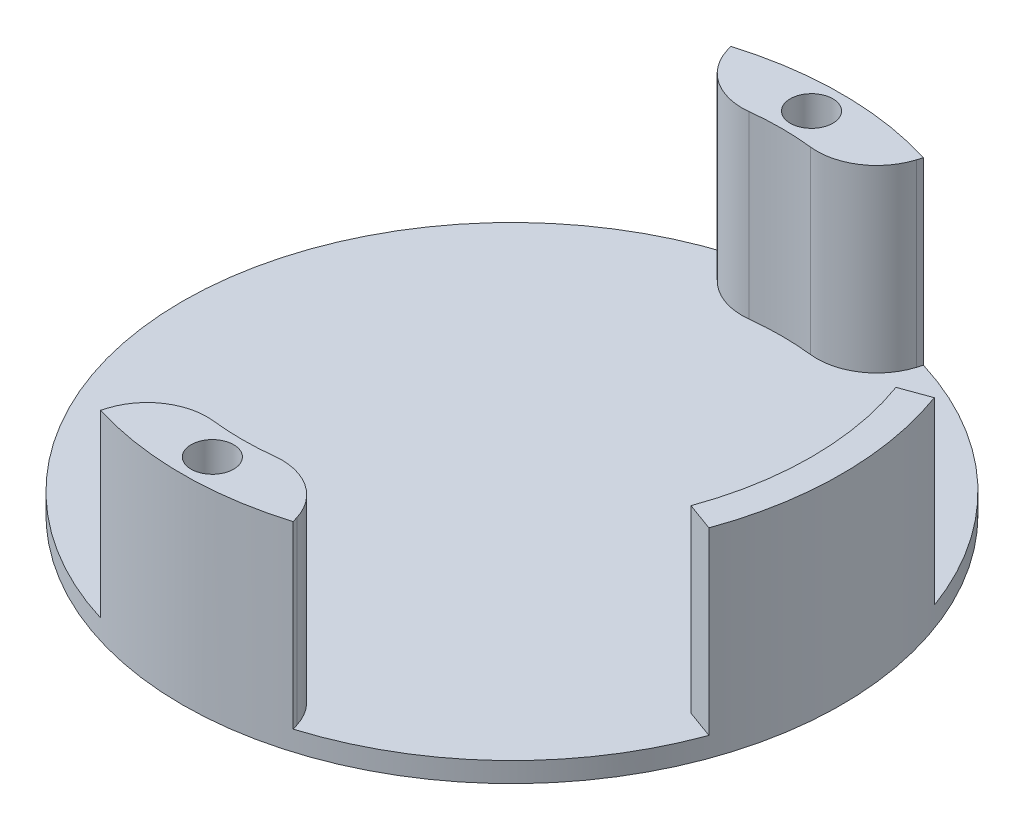
ISO-10303-21;
HEADER;
FILE_DESCRIPTION(('STEP AP214'),'2;1');
FILE_NAME('part.step','',(''),(''),'','','');
FILE_SCHEMA(('AUTOMOTIVE_DESIGN { 1 0 10303 214 1 1 1 1 }'));
ENDSEC;
DATA;
#1=APPLICATION_CONTEXT('core data for automotive mechanical design processes');
#2=APPLICATION_PROTOCOL_DEFINITION('international standard','automotive_design',2000,#1);
#3=PRODUCT_CONTEXT('',#1,'mechanical');
#4=PRODUCT('Part','Part','',(#3));
#5=PRODUCT_RELATED_PRODUCT_CATEGORY('part','',(#4));
#6=PRODUCT_DEFINITION_FORMATION('','',#4);
#7=PRODUCT_DEFINITION_CONTEXT('part definition',#1,'design');
#8=PRODUCT_DEFINITION('design','',#6,#7);
#9=PRODUCT_DEFINITION_SHAPE('','',#8);
#10=(LENGTH_UNIT() NAMED_UNIT(*) SI_UNIT(.MILLI.,.METRE.));
#11=(NAMED_UNIT(*) PLANE_ANGLE_UNIT() SI_UNIT($,.RADIAN.));
#12=(NAMED_UNIT(*) SI_UNIT($,.STERADIAN.) SOLID_ANGLE_UNIT());
#13=UNCERTAINTY_MEASURE_WITH_UNIT(LENGTH_MEASURE(1.E-05),#10,'distance_accuracy_value','');
#14=(GEOMETRIC_REPRESENTATION_CONTEXT(3) GLOBAL_UNCERTAINTY_ASSIGNED_CONTEXT((#13)) GLOBAL_UNIT_ASSIGNED_CONTEXT((#10,
#11,#12)) REPRESENTATION_CONTEXT('',''));
#15=CARTESIAN_POINT('',(0.,0.,0.));
#16=DIRECTION('',(0.,0.,1.));
#17=DIRECTION('',(1.,0.,0.));
#18=AXIS2_PLACEMENT_3D('',#15,#16,#17);
#19=CARTESIAN_POINT('',(7.93669994249363,42.3333333333333,-69.3976317609097));
#20=DIRECTION('',(0.,-1.,0.));
#21=DIRECTION('',(0.,0.,-1.));
#22=AXIS2_PLACEMENT_3D('',#19,#20,#21);
#23=CYLINDRICAL_SURFACE('',#22,12.7);
#24=DIRECTION('',(0.,-1.,0.));
#25=VECTOR('',#24,1.);
#26=CARTESIAN_POINT('',(6.49366358931297,42.3333333333333,-56.7798805316534));
#27=LINE('',#26,#25);
#28=CARTESIAN_POINT('',(6.49366358931298,4.23333333333333,-56.7798805316534));
#29=VERTEX_POINT('',#28);
#30=CARTESIAN_POINT('',(6.49366358931298,42.3333333333333,-56.7798805316534));
#31=VERTEX_POINT('',#30);
#32=EDGE_CURVE('E308',#29,#31,#27,.F.);
#33=ORIENTED_EDGE('',*,*,#32,.F.);
#34=CARTESIAN_POINT('',(7.93669994249363,4.23333333333333,-69.3976317609097));
#35=DIRECTION('',(0.,1.,0.));
#36=DIRECTION('',(0.,0.,1.));
#37=AXIS2_PLACEMENT_3D('',#34,#35,#36);
#38=CIRCLE('',#37,12.7);
#39=CARTESIAN_POINT('',(20.0817703432242,4.23333333333333,-65.6845111109309));
#40=VERTEX_POINT('',#39);
#41=EDGE_CURVE('E11',#29,#40,#38,.T.);
#42=ORIENTED_EDGE('',*,*,#41,.T.);
#43=DIRECTION('',(0.,-1.,0.));
#44=VECTOR('',#43,1.);
#45=CARTESIAN_POINT('',(20.0817703432242,42.3333333333333,-65.6845111109309));
#46=LINE('',#45,#44);
#47=CARTESIAN_POINT('',(20.0817703432242,42.3333333333333,-65.6845111109309));
#48=VERTEX_POINT('',#47);
#49=EDGE_CURVE('E321',#48,#40,#46,.T.);
#50=ORIENTED_EDGE('',*,*,#49,.F.);
#51=CARTESIAN_POINT('',(7.93669994249363,42.3333333333333,-69.3976317609097));
#52=DIRECTION('',(0.,1.,0.));
#53=DIRECTION('',(0.,0.,1.));
#54=AXIS2_PLACEMENT_3D('',#51,#52,#53);
#55=CIRCLE('',#54,12.7);
#56=EDGE_CURVE('E53',#31,#48,#55,.T.);
#57=ORIENTED_EDGE('',*,*,#56,.F.);
#58=EDGE_LOOP('',(#33,#42,#50,#57));
#59=FACE_BOUND('',#58,.T.);
#60=ADVANCED_FACE('F45',(#59),#23,.T.);
#61=CARTESIAN_POINT('',(0.,4.23333333333333,0.));
#62=DIRECTION('',(0.,1.,0.));
#63=DIRECTION('',(0.,0.,1.));
#64=AXIS2_PLACEMENT_3D('',#61,#62,#63);
#65=PLANE('',#64);
#66=ORIENTED_EDGE('',*,*,#41,.F.);
#67=CARTESIAN_POINT('',(0.,4.23333333333333,0.));
#68=DIRECTION('',(0.,1.,0.));
#69=DIRECTION('',(0.,0.,1.));
#70=AXIS2_PLACEMENT_3D('',#67,#68,#69);
#71=CIRCLE('',#70,57.15);
#72=CARTESIAN_POINT('',(-6.49366358931251,4.23333333333333,-56.7798805316534));
#73=VERTEX_POINT('',#72);
#74=EDGE_CURVE('E208',#29,#73,#71,.T.);
#75=ORIENTED_EDGE('',*,*,#74,.T.);
#76=CARTESIAN_POINT('',(-7.93669994249309,4.23333333333333,-69.3976317609097));
#77=DIRECTION('',(0.,1.,0.));
#78=DIRECTION('',(0.,0.,1.));
#79=AXIS2_PLACEMENT_3D('',#76,#77,#78);
#80=CIRCLE('',#79,12.7);
#81=CARTESIAN_POINT('',(-20.0817703432237,4.23333333333333,-65.6845111109311));
#82=VERTEX_POINT('',#81);
#83=EDGE_CURVE('E274',#82,#73,#80,.T.);
#84=ORIENTED_EDGE('',*,*,#83,.F.);
#85=DIRECTION('',(0.292371704722734,0.,0.956304755963036));
#86=VECTOR('',#85,1.);
#87=CARTESIAN_POINT('',(0.,4.23333333333333,0.));
#88=LINE('',#87,#86);
#89=CARTESIAN_POINT('',(-20.4221635748829,4.23333333333333,-66.7978872040181));
#90=VERTEX_POINT('',#89);
#91=EDGE_CURVE('E199',#90,#82,#88,.T.);
#92=ORIENTED_EDGE('',*,*,#91,.F.);
#93=CARTESIAN_POINT('',(0.,4.23333333333333,0.));
#94=DIRECTION('',(0.,1.,0.));
#95=DIRECTION('',(0.,0.,1.));
#96=AXIS2_PLACEMENT_3D('',#93,#94,#95);
#97=CIRCLE('',#96,69.85);
#98=CARTESIAN_POINT('',(-20.4221635748835,4.23333333333333,66.7978872040179));
#99=VERTEX_POINT('',#98);
#100=EDGE_CURVE('E259',#90,#99,#97,.T.);
#101=ORIENTED_EDGE('',*,*,#100,.T.);
#102=DIRECTION('',(-0.292371704722741,0.,0.956304755963034));
#103=VECTOR('',#102,1.);
#104=CARTESIAN_POINT('',(0.,4.23333333333333,0.));
#105=LINE('',#104,#103);
#106=CARTESIAN_POINT('',(-20.0817703432242,4.23333333333333,65.6845111109309));
#107=VERTEX_POINT('',#106);
#108=EDGE_CURVE('E241',#107,#99,#105,.T.);
#109=ORIENTED_EDGE('',*,*,#108,.F.);
#110=CARTESIAN_POINT('',(-7.93669994249365,4.23333333333333,69.3976317609097));
#111=DIRECTION('',(0.,1.,0.));
#112=DIRECTION('',(0.,0.,1.));
#113=AXIS2_PLACEMENT_3D('',#110,#111,#112);
#114=CIRCLE('',#113,12.7);
#115=CARTESIAN_POINT('',(-6.49366358931301,4.23333333333333,56.7798805316534));
#116=VERTEX_POINT('',#115);
#117=EDGE_CURVE('E305',#116,#107,#114,.T.);
#118=ORIENTED_EDGE('',*,*,#117,.F.);
#119=CARTESIAN_POINT('',(0.,4.23333333333333,0.));
#120=DIRECTION('',(0.,1.,0.));
#121=DIRECTION('',(0.,0.,1.));
#122=AXIS2_PLACEMENT_3D('',#119,#120,#121);
#123=CIRCLE('',#122,57.15);
#124=CARTESIAN_POINT('',(6.49366358931253,4.23333333333333,56.7798805316534));
#125=VERTEX_POINT('',#124);
#126=EDGE_CURVE('E211',#116,#125,#123,.T.);
#127=ORIENTED_EDGE('',*,*,#126,.T.);
#128=CARTESIAN_POINT('',(7.9366999424931,4.23333333333333,69.3976317609097));
#129=DIRECTION('',(0.,1.,0.));
#130=DIRECTION('',(0.,0.,1.));
#131=AXIS2_PLACEMENT_3D('',#128,#129,#130);
#132=CIRCLE('',#131,12.7);
#133=CARTESIAN_POINT('',(20.0817703432237,4.23333333333333,65.6845111109311));
#134=VERTEX_POINT('',#133);
#135=EDGE_CURVE('E290',#134,#125,#132,.T.);
#136=ORIENTED_EDGE('',*,*,#135,.F.);
#137=DIRECTION('',(0.292371704722734,0.,0.956304755963036));
#138=VECTOR('',#137,1.);
#139=CARTESIAN_POINT('',(0.,4.23333333333333,0.));
#140=LINE('',#139,#138);
#141=CARTESIAN_POINT('',(20.4221635748829,4.23333333333333,66.7978872040181));
#142=VERTEX_POINT('',#141);
#143=EDGE_CURVE('E228',#134,#142,#140,.T.);
#144=ORIENTED_EDGE('',*,*,#143,.T.);
#145=CARTESIAN_POINT('',(65.6375295618957,4.23333333333333,23.8901070112981));
#146=VERTEX_POINT('',#145);
#147=EDGE_CURVE('E254',#142,#146,#97,.T.);
#148=ORIENTED_EDGE('',*,*,#147,.T.);
#149=DIRECTION('',(0.939692620785908,0.,0.34202014332567));
#150=VECTOR('',#149,1.);
#151=CARTESIAN_POINT('',(59.6704814199052,4.23333333333333,21.7182791011801));
#152=LINE('',#151,#150);
#153=CARTESIAN_POINT('',(59.6704814199052,4.23333333333333,21.7182791011801));
#154=VERTEX_POINT('',#153);
#155=EDGE_CURVE('E370',#154,#146,#152,.T.);
#156=ORIENTED_EDGE('',*,*,#155,.F.);
#157=CARTESIAN_POINT('',(0.,4.23333333333333,0.));
#158=DIRECTION('',(0.,-1.,0.));
#159=DIRECTION('',(0.,0.,1.));
#160=AXIS2_PLACEMENT_3D('',#157,#158,#159);
#161=CIRCLE('',#160,63.5);
#162=CARTESIAN_POINT('',(59.6704814199052,4.23333333333333,-21.71827910118));
#163=VERTEX_POINT('',#162);
#164=EDGE_CURVE('E182',#163,#154,#161,.T.);
#165=ORIENTED_EDGE('',*,*,#164,.F.);
#166=DIRECTION('',(-0.939692620785908,0.,0.342020143325669));
#167=VECTOR('',#166,1.);
#168=CARTESIAN_POINT('',(59.6704814199052,4.23333333333333,-21.71827910118));
#169=LINE('',#168,#167);
#170=CARTESIAN_POINT('',(65.6375295618957,4.23333333333333,-23.890107011298));
#171=VERTEX_POINT('',#170);
#172=EDGE_CURVE('E179',#171,#163,#169,.T.);
#173=ORIENTED_EDGE('',*,*,#172,.F.);
#174=CARTESIAN_POINT('',(20.4221635748835,4.23333333333333,-66.7978872040179));
#175=VERTEX_POINT('',#174);
#176=EDGE_CURVE('E258',#171,#175,#97,.T.);
#177=ORIENTED_EDGE('',*,*,#176,.T.);
#178=DIRECTION('',(-0.292371704722741,0.,0.956304755963034));
#179=VECTOR('',#178,1.);
#180=CARTESIAN_POINT('',(0.,4.23333333333333,0.));
#181=LINE('',#180,#179);
#182=EDGE_CURVE('E203',#175,#40,#181,.T.);
#183=ORIENTED_EDGE('',*,*,#182,.T.);
#184=EDGE_LOOP('',(#66,#75,#84,#92,#101,#109,#118,#127,#136,#144,#148,#156,#165,#173,#177,#183));
#185=FACE_BOUND('',#184,.T.);
#186=ADVANCED_FACE('F330',(#185),#65,.T.);
#187=CARTESIAN_POINT('',(-7.93669994249365,42.3333333333333,69.3976317609097));
#188=DIRECTION('',(0.,-1.,0.));
#189=DIRECTION('',(0.,0.,-1.));
#190=AXIS2_PLACEMENT_3D('',#187,#188,#189);
#191=CYLINDRICAL_SURFACE('',#190,12.7);
#192=DIRECTION('',(0.,-1.,0.));
#193=VECTOR('',#192,1.);
#194=CARTESIAN_POINT('',(-6.49366358931298,42.3333333333333,56.7798805316534));
#195=LINE('',#194,#193);
#196=CARTESIAN_POINT('',(-6.49366358931301,42.3333333333333,56.7798805316534));
#197=VERTEX_POINT('',#196);
#198=EDGE_CURVE('E294',#116,#197,#195,.F.);
#199=ORIENTED_EDGE('',*,*,#198,.F.);
#200=ORIENTED_EDGE('',*,*,#117,.T.);
#201=DIRECTION('',(0.,1.,0.));
#202=VECTOR('',#201,1.);
#203=CARTESIAN_POINT('',(-20.0817703432242,42.3333333333333,65.6845111109309));
#204=LINE('',#203,#202);
#205=CARTESIAN_POINT('',(-20.0817703432242,42.3333333333333,65.6845111109309));
#206=VERTEX_POINT('',#205);
#207=EDGE_CURVE('E298',#206,#107,#204,.F.);
#208=ORIENTED_EDGE('',*,*,#207,.F.);
#209=CARTESIAN_POINT('',(-7.93669994249365,42.3333333333333,69.3976317609097));
#210=DIRECTION('',(0.,1.,0.));
#211=DIRECTION('',(0.,0.,1.));
#212=AXIS2_PLACEMENT_3D('',#209,#210,#211);
#213=CIRCLE('',#212,12.7);
#214=EDGE_CURVE('E302',#197,#206,#213,.T.);
#215=ORIENTED_EDGE('',*,*,#214,.F.);
#216=EDGE_LOOP('',(#199,#200,#208,#215));
#217=FACE_BOUND('',#216,.T.);
#218=ADVANCED_FACE('F345',(#217),#191,.T.);
#219=CARTESIAN_POINT('',(7.9366999424931,42.3333333333333,69.3976317609097));
#220=DIRECTION('',(0.,-1.,0.));
#221=DIRECTION('',(0.,0.,-1.));
#222=AXIS2_PLACEMENT_3D('',#219,#220,#221);
#223=CYLINDRICAL_SURFACE('',#222,12.7);
#224=DIRECTION('',(0.,-1.,0.));
#225=VECTOR('',#224,1.);
#226=CARTESIAN_POINT('',(6.49366358931253,42.3333333333333,56.7798805316534));
#227=LINE('',#226,#225);
#228=CARTESIAN_POINT('',(6.49366358931253,42.3333333333333,56.7798805316534));
#229=VERTEX_POINT('',#228);
#230=EDGE_CURVE('E278',#229,#125,#227,.T.);
#231=ORIENTED_EDGE('',*,*,#230,.F.);
#232=CARTESIAN_POINT('',(7.9366999424931,42.3333333333333,69.3976317609097));
#233=DIRECTION('',(0.,1.,0.));
#234=DIRECTION('',(0.,0.,1.));
#235=AXIS2_PLACEMENT_3D('',#232,#233,#234);
#236=CIRCLE('',#235,12.7);
#237=CARTESIAN_POINT('',(20.0817703432237,42.3333333333333,65.6845111109311));
#238=VERTEX_POINT('',#237);
#239=EDGE_CURVE('E286',#238,#229,#236,.T.);
#240=ORIENTED_EDGE('',*,*,#239,.F.);
#241=DIRECTION('',(0.,-1.,0.));
#242=VECTOR('',#241,1.);
#243=CARTESIAN_POINT('',(20.0817703432237,42.3333333333333,65.684511110931));
#244=LINE('',#243,#242);
#245=EDGE_CURVE('E282',#134,#238,#244,.F.);
#246=ORIENTED_EDGE('',*,*,#245,.F.);
#247=ORIENTED_EDGE('',*,*,#135,.T.);
#248=EDGE_LOOP('',(#231,#240,#246,#247));
#249=FACE_BOUND('',#248,.T.);
#250=ADVANCED_FACE('F351',(#249),#223,.T.);
#251=CARTESIAN_POINT('',(-7.93669994249309,42.3333333333333,-69.3976317609097));
#252=DIRECTION('',(0.,-1.,0.));
#253=DIRECTION('',(0.,0.,-1.));
#254=AXIS2_PLACEMENT_3D('',#251,#252,#253);
#255=CYLINDRICAL_SURFACE('',#254,12.7);
#256=DIRECTION('',(0.,1.,0.));
#257=VECTOR('',#256,1.);
#258=CARTESIAN_POINT('',(-20.0817703432236,42.3333333333333,-65.684511110931));
#259=LINE('',#258,#257);
#260=CARTESIAN_POINT('',(-20.0817703432237,42.3333333333333,-65.6845111109311));
#261=VERTEX_POINT('',#260);
#262=EDGE_CURVE('E257',#82,#261,#259,.T.);
#263=ORIENTED_EDGE('',*,*,#262,.F.);
#264=ORIENTED_EDGE('',*,*,#83,.T.);
#265=DIRECTION('',(0.,-1.,0.));
#266=VECTOR('',#265,1.);
#267=CARTESIAN_POINT('',(-6.49366358931253,42.3333333333333,-56.7798805316534));
#268=LINE('',#267,#266);
#269=CARTESIAN_POINT('',(-6.49366358931251,42.3333333333333,-56.7798805316534));
#270=VERTEX_POINT('',#269);
#271=EDGE_CURVE('E266',#270,#73,#268,.T.);
#272=ORIENTED_EDGE('',*,*,#271,.F.);
#273=CARTESIAN_POINT('',(-7.93669994249309,42.3333333333333,-69.3976317609097));
#274=DIRECTION('',(0.,1.,0.));
#275=DIRECTION('',(0.,0.,1.));
#276=AXIS2_PLACEMENT_3D('',#273,#274,#275);
#277=CIRCLE('',#276,12.7);
#278=EDGE_CURVE('E270',#261,#270,#277,.T.);
#279=ORIENTED_EDGE('',*,*,#278,.F.);
#280=EDGE_LOOP('',(#263,#264,#272,#279));
#281=FACE_BOUND('',#280,.T.);
#282=ADVANCED_FACE('F393',(#281),#255,.T.);
#283=CARTESIAN_POINT('',(0.,4.23333333333333,0.));
#284=DIRECTION('',(0.,-1.,0.));
#285=DIRECTION('',(0.,0.,-1.));
#286=AXIS2_PLACEMENT_3D('',#283,#284,#285);
#287=CYLINDRICAL_SURFACE('',#286,69.85);
#288=ORIENTED_EDGE('',*,*,#147,.F.);
#289=DIRECTION('',(0.,-1.,0.));
#290=VECTOR('',#289,1.);
#291=CARTESIAN_POINT('',(20.4221635748829,42.3333333333333,66.7978872040181));
#292=LINE('',#291,#290);
#293=CARTESIAN_POINT('',(20.4221635748829,42.3333333333333,66.7978872040181));
#294=VERTEX_POINT('',#293);
#295=EDGE_CURVE('E238',#294,#142,#292,.T.);
#296=ORIENTED_EDGE('',*,*,#295,.F.);
#297=CARTESIAN_POINT('',(0.,42.3333333333333,0.));
#298=DIRECTION('',(0.,1.,0.));
#299=DIRECTION('',(0.,0.,1.));
#300=AXIS2_PLACEMENT_3D('',#297,#298,#299);
#301=CIRCLE('',#300,69.85);
#302=CARTESIAN_POINT('',(-20.4221635748835,42.3333333333333,66.7978872040179));
#303=VERTEX_POINT('',#302);
#304=EDGE_CURVE('E231',#303,#294,#301,.T.);
#305=ORIENTED_EDGE('',*,*,#304,.F.);
#306=DIRECTION('',(0.,-1.,0.));
#307=VECTOR('',#306,1.);
#308=CARTESIAN_POINT('',(-20.4221635748835,42.3333333333333,66.7978872040179));
#309=LINE('',#308,#307);
#310=EDGE_CURVE('E249',#303,#99,#309,.T.);
#311=ORIENTED_EDGE('',*,*,#310,.T.);
#312=ORIENTED_EDGE('',*,*,#100,.F.);
#313=DIRECTION('',(0.,-1.,0.));
#314=VECTOR('',#313,1.);
#315=CARTESIAN_POINT('',(-20.4221635748829,42.3333333333333,-66.7978872040181));
#316=LINE('',#315,#314);
#317=CARTESIAN_POINT('',(-20.4221635748829,42.3333333333333,-66.7978872040181));
#318=VERTEX_POINT('',#317);
#319=EDGE_CURVE('E189',#318,#90,#316,.T.);
#320=ORIENTED_EDGE('',*,*,#319,.F.);
#321=CARTESIAN_POINT('',(0.,42.3333333333333,0.));
#322=DIRECTION('',(0.,1.,0.));
#323=DIRECTION('',(0.,0.,1.));
#324=AXIS2_PLACEMENT_3D('',#321,#322,#323);
#325=CIRCLE('',#324,69.85);
#326=CARTESIAN_POINT('',(20.4221635748835,42.3333333333333,-66.7978872040179));
#327=VERTEX_POINT('',#326);
#328=EDGE_CURVE('E215',#327,#318,#325,.T.);
#329=ORIENTED_EDGE('',*,*,#328,.F.);
#330=DIRECTION('',(0.,-1.,0.));
#331=VECTOR('',#330,1.);
#332=CARTESIAN_POINT('',(20.4221635748835,42.3333333333333,-66.7978872040179));
#333=LINE('',#332,#331);
#334=EDGE_CURVE('E184',#327,#175,#333,.T.);
#335=ORIENTED_EDGE('',*,*,#334,.T.);
#336=ORIENTED_EDGE('',*,*,#176,.F.);
#337=DIRECTION('',(0.,-1.,0.));
#338=VECTOR('',#337,1.);
#339=CARTESIAN_POINT('',(65.6375295618957,42.3333333333333,-23.890107011298));
#340=LINE('',#339,#338);
#341=CARTESIAN_POINT('',(65.6375295618957,42.3333333333333,-23.890107011298));
#342=VERTEX_POINT('',#341);
#343=EDGE_CURVE('E191',#342,#171,#340,.T.);
#344=ORIENTED_EDGE('',*,*,#343,.F.);
#345=CARTESIAN_POINT('',(0.,42.3333333333333,0.));
#346=DIRECTION('',(0.,1.,0.));
#347=DIRECTION('',(0.,0.,1.));
#348=AXIS2_PLACEMENT_3D('',#345,#346,#347);
#349=CIRCLE('',#348,69.85);
#350=CARTESIAN_POINT('',(65.6375295618957,42.3333333333333,23.8901070112981));
#351=VERTEX_POINT('',#350);
#352=EDGE_CURVE('E168',#351,#342,#349,.T.);
#353=ORIENTED_EDGE('',*,*,#352,.F.);
#354=DIRECTION('',(0.,-1.,0.));
#355=VECTOR('',#354,1.);
#356=CARTESIAN_POINT('',(65.6375295618957,42.3333333333333,23.8901070112981));
#357=LINE('',#356,#355);
#358=EDGE_CURVE('E164',#351,#146,#357,.T.);
#359=ORIENTED_EDGE('',*,*,#358,.T.);
#360=EDGE_LOOP('',(#288,#296,#305,#311,#312,#320,#329,#335,#336,#344,#353,#359));
#361=FACE_BOUND('',#360,.T.);
#362=CARTESIAN_POINT('',(0.,0.,0.));
#363=DIRECTION('',(0.,1.,0.));
#364=DIRECTION('',(0.,0.,1.));
#365=AXIS2_PLACEMENT_3D('',#362,#363,#364);
#366=CIRCLE('',#365,69.85);
#367=CARTESIAN_POINT('',(0.,0.,69.85));
#368=VERTEX_POINT('',#367);
#369=EDGE_CURVE('E253',#368,#368,#366,.T.);
#370=ORIENTED_EDGE('',*,*,#369,.T.);
#371=EDGE_LOOP('',(#370));
#372=FACE_BOUND('',#371,.T.);
#373=ADVANCED_FACE('F336',(#361,#372),#287,.T.);
#374=CARTESIAN_POINT('',(0.,0.,0.));
#375=DIRECTION('',(0.,1.,0.));
#376=DIRECTION('',(0.,0.,1.));
#377=AXIS2_PLACEMENT_3D('',#374,#375,#376);
#378=PLANE('',#377);
#379=CARTESIAN_POINT('',(-7.19554542014061E-13,0.,-63.5));
#380=DIRECTION('',(0.,1.,0.));
#381=DIRECTION('',(0.,0.,1.));
#382=AXIS2_PLACEMENT_3D('',#379,#380,#381);
#383=CIRCLE('',#382,4.50850000000069);
#384=CARTESIAN_POINT('',(-7.19554542014061E-13,0.,-58.9914999999993));
#385=VERTEX_POINT('',#384);
#386=EDGE_CURVE('E314',#385,#385,#383,.T.);
#387=ORIENTED_EDGE('',*,*,#386,.T.);
#388=EDGE_LOOP('',(#387));
#389=FACE_BOUND('',#388,.T.);
#390=CARTESIAN_POINT('',(8.2250045005362E-13,0.,63.5));
#391=DIRECTION('',(0.,1.,0.));
#392=DIRECTION('',(0.,0.,1.));
#393=AXIS2_PLACEMENT_3D('',#390,#391,#392);
#394=CIRCLE('',#393,4.50849999999979);
#395=CARTESIAN_POINT('',(8.2250045005362E-13,0.,68.0084999999998));
#396=VERTEX_POINT('',#395);
#397=EDGE_CURVE('E631',#396,#396,#394,.T.);
#398=ORIENTED_EDGE('',*,*,#397,.T.);
#399=EDGE_LOOP('',(#398));
#400=FACE_BOUND('',#399,.T.);
#401=ORIENTED_EDGE('',*,*,#369,.F.);
#402=EDGE_LOOP('',(#401));
#403=FACE_BOUND('',#402,.T.);
#404=ADVANCED_FACE('F417',(#389,#400,#403),#378,.F.);
#405=CARTESIAN_POINT('',(0.,42.3333333333333,0.));
#406=DIRECTION('',(0.,-1.,0.));
#407=DIRECTION('',(0.,0.,-1.));
#408=AXIS2_PLACEMENT_3D('',#405,#406,#407);
#409=CYLINDRICAL_SURFACE('',#408,57.15);
#410=ORIENTED_EDGE('',*,*,#126,.F.);
#411=ORIENTED_EDGE('',*,*,#198,.T.);
#412=CARTESIAN_POINT('',(0.,42.3333333333333,0.));
#413=DIRECTION('',(0.,1.,0.));
#414=DIRECTION('',(0.,0.,1.));
#415=AXIS2_PLACEMENT_3D('',#412,#413,#414);
#416=CIRCLE('',#415,57.15);
#417=EDGE_CURVE('E224',#197,#229,#416,.T.);
#418=ORIENTED_EDGE('',*,*,#417,.T.);
#419=ORIENTED_EDGE('',*,*,#230,.T.);
#420=EDGE_LOOP('',(#410,#411,#418,#419));
#421=FACE_BOUND('',#420,.T.);
#422=ADVANCED_FACE('F353',(#421),#409,.F.);
#423=CARTESIAN_POINT('',(0.,42.3333333333333,0.));
#424=DIRECTION('',(0.956304755963034,0.,0.292371704722741));
#425=DIRECTION('',(0.292371704722741,0.,-0.956304755963034));
#426=AXIS2_PLACEMENT_3D('',#423,#424,#425);
#427=PLANE('',#426);
#428=DIRECTION('',(-0.292371704722741,0.,0.956304755963034));
#429=VECTOR('',#428,1.);
#430=CARTESIAN_POINT('',(0.,42.3333333333333,0.));
#431=LINE('',#430,#429);
#432=EDGE_CURVE('E227',#206,#303,#431,.T.);
#433=ORIENTED_EDGE('',*,*,#432,.F.);
#434=ORIENTED_EDGE('',*,*,#207,.T.);
#435=ORIENTED_EDGE('',*,*,#108,.T.);
#436=ORIENTED_EDGE('',*,*,#310,.F.);
#437=EDGE_LOOP('',(#433,#434,#435,#436));
#438=FACE_BOUND('',#437,.T.);
#439=ADVANCED_FACE('F341',(#438),#427,.F.);
#440=CARTESIAN_POINT('',(0.,42.3333333333333,0.));
#441=DIRECTION('',(0.956304755963036,0.,-0.292371704722734));
#442=DIRECTION('',(-0.292371704722734,0.,-0.956304755963037));
#443=AXIS2_PLACEMENT_3D('',#440,#441,#442);
#444=PLANE('',#443);
#445=ORIENTED_EDGE('',*,*,#143,.F.);
#446=ORIENTED_EDGE('',*,*,#245,.T.);
#447=DIRECTION('',(0.292371704722734,0.,0.956304755963036));
#448=VECTOR('',#447,1.);
#449=CARTESIAN_POINT('',(0.,42.3333333333333,0.));
#450=LINE('',#449,#448);
#451=EDGE_CURVE('E235',#238,#294,#450,.T.);
#452=ORIENTED_EDGE('',*,*,#451,.T.);
#453=ORIENTED_EDGE('',*,*,#295,.T.);
#454=EDGE_LOOP('',(#445,#446,#452,#453));
#455=FACE_BOUND('',#454,.T.);
#456=ADVANCED_FACE('F359',(#455),#444,.T.);
#457=CARTESIAN_POINT('',(0.,42.3333333333333,0.));
#458=DIRECTION('',(0.,1.,0.));
#459=DIRECTION('',(0.,0.,1.));
#460=AXIS2_PLACEMENT_3D('',#457,#458,#459);
#461=PLANE('',#460);
#462=CARTESIAN_POINT('',(8.2250045005362E-13,42.3333333333333,63.5));
#463=DIRECTION('',(0.,1.,0.));
#464=DIRECTION('',(0.,0.,1.));
#465=AXIS2_PLACEMENT_3D('',#462,#463,#464);
#466=CIRCLE('',#465,4.50849999999979);
#467=CARTESIAN_POINT('',(8.2250045005362E-13,42.3333333333333,68.0084999999998));
#468=VERTEX_POINT('',#467);
#469=EDGE_CURVE('E313',#468,#468,#466,.T.);
#470=ORIENTED_EDGE('',*,*,#469,.F.);
#471=EDGE_LOOP('',(#470));
#472=FACE_BOUND('',#471,.T.);
#473=ORIENTED_EDGE('',*,*,#417,.F.);
#474=ORIENTED_EDGE('',*,*,#214,.T.);
#475=ORIENTED_EDGE('',*,*,#432,.T.);
#476=ORIENTED_EDGE('',*,*,#304,.T.);
#477=ORIENTED_EDGE('',*,*,#451,.F.);
#478=ORIENTED_EDGE('',*,*,#239,.T.);
#479=EDGE_LOOP('',(#473,#474,#475,#476,#477,#478));
#480=FACE_BOUND('',#479,.T.);
#481=ADVANCED_FACE('F357',(#472,#480),#461,.T.);
#482=CARTESIAN_POINT('',(0.,42.3333333333333,0.));
#483=DIRECTION('',(0.,-1.,0.));
#484=DIRECTION('',(0.,0.,-1.));
#485=AXIS2_PLACEMENT_3D('',#482,#483,#484);
#486=CYLINDRICAL_SURFACE('',#485,57.15);
#487=ORIENTED_EDGE('',*,*,#74,.F.);
#488=ORIENTED_EDGE('',*,*,#32,.T.);
#489=CARTESIAN_POINT('',(0.,42.3333333333333,0.));
#490=DIRECTION('',(0.,1.,0.));
#491=DIRECTION('',(0.,0.,1.));
#492=AXIS2_PLACEMENT_3D('',#489,#490,#491);
#493=CIRCLE('',#492,57.15);
#494=EDGE_CURVE('E204',#31,#270,#493,.T.);
#495=ORIENTED_EDGE('',*,*,#494,.T.);
#496=ORIENTED_EDGE('',*,*,#271,.T.);
#497=EDGE_LOOP('',(#487,#488,#495,#496));
#498=FACE_BOUND('',#497,.T.);
#499=ADVANCED_FACE('F387',(#498),#486,.F.);
#500=CARTESIAN_POINT('',(0.,42.3333333333333,0.));
#501=DIRECTION('',(0.956304755963034,0.,0.292371704722741));
#502=DIRECTION('',(0.292371704722741,0.,-0.956304755963034));
#503=AXIS2_PLACEMENT_3D('',#500,#501,#502);
#504=PLANE('',#503);
#505=DIRECTION('',(-0.292371704722741,0.,0.956304755963034));
#506=VECTOR('',#505,1.);
#507=CARTESIAN_POINT('',(0.,42.3333333333333,0.));
#508=LINE('',#507,#506);
#509=EDGE_CURVE('E218',#327,#48,#508,.T.);
#510=ORIENTED_EDGE('',*,*,#509,.T.);
#511=ORIENTED_EDGE('',*,*,#49,.T.);
#512=ORIENTED_EDGE('',*,*,#182,.F.);
#513=ORIENTED_EDGE('',*,*,#334,.F.);
#514=EDGE_LOOP('',(#510,#511,#512,#513));
#515=FACE_BOUND('',#514,.T.);
#516=ADVANCED_FACE('F384',(#515),#504,.T.);
#517=CARTESIAN_POINT('',(0.,42.3333333333333,0.));
#518=DIRECTION('',(0.956304755963036,0.,-0.292371704722734));
#519=DIRECTION('',(-0.292371704722734,0.,-0.956304755963037));
#520=AXIS2_PLACEMENT_3D('',#517,#518,#519);
#521=PLANE('',#520);
#522=ORIENTED_EDGE('',*,*,#91,.T.);
#523=ORIENTED_EDGE('',*,*,#262,.T.);
#524=DIRECTION('',(0.292371704722734,0.,0.956304755963036));
#525=VECTOR('',#524,1.);
#526=CARTESIAN_POINT('',(0.,42.3333333333333,0.));
#527=LINE('',#526,#525);
#528=EDGE_CURVE('E198',#318,#261,#527,.T.);
#529=ORIENTED_EDGE('',*,*,#528,.F.);
#530=ORIENTED_EDGE('',*,*,#319,.T.);
#531=EDGE_LOOP('',(#522,#523,#529,#530));
#532=FACE_BOUND('',#531,.T.);
#533=ADVANCED_FACE('F395',(#532),#521,.F.);
#534=CARTESIAN_POINT('',(0.,42.3333333333333,0.));
#535=DIRECTION('',(0.,1.,0.));
#536=DIRECTION('',(0.,0.,1.));
#537=AXIS2_PLACEMENT_3D('',#534,#535,#536);
#538=PLANE('',#537);
#539=CARTESIAN_POINT('',(-7.19554542014061E-13,42.3333333333333,-63.5));
#540=DIRECTION('',(0.,1.,0.));
#541=DIRECTION('',(0.,0.,1.));
#542=AXIS2_PLACEMENT_3D('',#539,#540,#541);
#543=CIRCLE('',#542,4.50850000000069);
#544=CARTESIAN_POINT('',(-7.19554542014061E-13,42.3333333333333,-58.9914999999993));
#545=VERTEX_POINT('',#544);
#546=EDGE_CURVE('E309',#545,#545,#543,.T.);
#547=ORIENTED_EDGE('',*,*,#546,.F.);
#548=EDGE_LOOP('',(#547));
#549=FACE_BOUND('',#548,.T.);
#550=ORIENTED_EDGE('',*,*,#494,.F.);
#551=ORIENTED_EDGE('',*,*,#56,.T.);
#552=ORIENTED_EDGE('',*,*,#509,.F.);
#553=ORIENTED_EDGE('',*,*,#328,.T.);
#554=ORIENTED_EDGE('',*,*,#528,.T.);
#555=ORIENTED_EDGE('',*,*,#278,.T.);
#556=EDGE_LOOP('',(#550,#551,#552,#553,#554,#555));
#557=FACE_BOUND('',#556,.T.);
#558=ADVANCED_FACE('F388',(#549,#557),#538,.T.);
#559=CARTESIAN_POINT('',(0.,42.3333333333333,0.));
#560=DIRECTION('',(0.,-1.,0.));
#561=DIRECTION('',(0.,0.,-1.));
#562=AXIS2_PLACEMENT_3D('',#559,#560,#561);
#563=CYLINDRICAL_SURFACE('',#562,63.5);
#564=ORIENTED_EDGE('',*,*,#164,.T.);
#565=DIRECTION('',(0.,-1.,0.));
#566=VECTOR('',#565,1.);
#567=CARTESIAN_POINT('',(59.6704814199052,42.3333333333333,21.7182791011801));
#568=LINE('',#567,#566);
#569=CARTESIAN_POINT('',(59.6704814199052,42.3333333333333,21.7182791011801));
#570=VERTEX_POINT('',#569);
#571=EDGE_CURVE('E161',#570,#154,#568,.T.);
#572=ORIENTED_EDGE('',*,*,#571,.F.);
#573=CARTESIAN_POINT('',(0.,42.3333333333333,0.));
#574=DIRECTION('',(0.,-1.,0.));
#575=DIRECTION('',(0.,0.,1.));
#576=AXIS2_PLACEMENT_3D('',#573,#574,#575);
#577=CIRCLE('',#576,63.5);
#578=CARTESIAN_POINT('',(59.6704814199052,42.3333333333333,-21.71827910118));
#579=VERTEX_POINT('',#578);
#580=EDGE_CURVE('E169',#579,#570,#577,.T.);
#581=ORIENTED_EDGE('',*,*,#580,.F.);
#582=DIRECTION('',(0.,-1.,0.));
#583=VECTOR('',#582,1.);
#584=CARTESIAN_POINT('',(59.6704814199052,42.3333333333333,-21.71827910118));
#585=LINE('',#584,#583);
#586=EDGE_CURVE('E365',#579,#163,#585,.T.);
#587=ORIENTED_EDGE('',*,*,#586,.T.);
#588=EDGE_LOOP('',(#564,#572,#581,#587));
#589=FACE_BOUND('',#588,.T.);
#590=ADVANCED_FACE('F181',(#589),#563,.F.);
#591=CARTESIAN_POINT('',(59.6704814199052,42.3333333333333,21.7182791011801));
#592=DIRECTION('',(0.34202014332567,0.,-0.939692620785908));
#593=DIRECTION('',(-0.939692620785908,0.,-0.34202014332567));
#594=AXIS2_PLACEMENT_3D('',#591,#592,#593);
#595=PLANE('',#594);
#596=ORIENTED_EDGE('',*,*,#155,.T.);
#597=ORIENTED_EDGE('',*,*,#358,.F.);
#598=DIRECTION('',(0.939692620785908,0.,0.34202014332567));
#599=VECTOR('',#598,1.);
#600=CARTESIAN_POINT('',(59.6704814199052,42.3333333333333,21.7182791011801));
#601=LINE('',#600,#599);
#602=EDGE_CURVE('E156',#570,#351,#601,.T.);
#603=ORIENTED_EDGE('',*,*,#602,.F.);
#604=ORIENTED_EDGE('',*,*,#571,.T.);
#605=EDGE_LOOP('',(#596,#597,#603,#604));
#606=FACE_BOUND('',#605,.T.);
#607=ADVANCED_FACE('F159',(#606),#595,.F.);
#608=CARTESIAN_POINT('',(59.6704814199052,42.3333333333333,-21.71827910118));
#609=DIRECTION('',(0.342020143325669,0.,0.939692620785908));
#610=DIRECTION('',(0.939692620785908,0.,-0.342020143325669));
#611=AXIS2_PLACEMENT_3D('',#608,#609,#610);
#612=PLANE('',#611);
#613=ORIENTED_EDGE('',*,*,#172,.T.);
#614=ORIENTED_EDGE('',*,*,#586,.F.);
#615=DIRECTION('',(-0.939692620785908,0.,0.342020143325669));
#616=VECTOR('',#615,1.);
#617=CARTESIAN_POINT('',(59.6704814199052,42.3333333333333,-21.71827910118));
#618=LINE('',#617,#616);
#619=EDGE_CURVE('E174',#342,#579,#618,.T.);
#620=ORIENTED_EDGE('',*,*,#619,.F.);
#621=ORIENTED_EDGE('',*,*,#343,.T.);
#622=EDGE_LOOP('',(#613,#614,#620,#621));
#623=FACE_BOUND('',#622,.T.);
#624=ADVANCED_FACE('F379',(#623),#612,.F.);
#625=CARTESIAN_POINT('',(0.,42.3333333333333,0.));
#626=DIRECTION('',(0.,1.,0.));
#627=DIRECTION('',(0.,0.,1.));
#628=AXIS2_PLACEMENT_3D('',#625,#626,#627);
#629=PLANE('',#628);
#630=ORIENTED_EDGE('',*,*,#580,.T.);
#631=ORIENTED_EDGE('',*,*,#602,.T.);
#632=ORIENTED_EDGE('',*,*,#352,.T.);
#633=ORIENTED_EDGE('',*,*,#619,.T.);
#634=EDGE_LOOP('',(#630,#631,#632,#633));
#635=FACE_BOUND('',#634,.T.);
#636=ADVANCED_FACE('F172',(#635),#629,.T.);
#637=CARTESIAN_POINT('',(-7.19554542014061E-13,0.,-63.5));
#638=DIRECTION('',(0.,1.,0.));
#639=DIRECTION('',(0.,0.,1.));
#640=AXIS2_PLACEMENT_3D('',#637,#638,#639);
#641=CYLINDRICAL_SURFACE('',#640,4.50850000000069);
#642=ORIENTED_EDGE('',*,*,#546,.T.);
#643=EDGE_LOOP('',(#642));
#644=FACE_BOUND('',#643,.T.);
#645=ORIENTED_EDGE('',*,*,#386,.F.);
#646=EDGE_LOOP('',(#645));
#647=FACE_BOUND('',#646,.T.);
#648=ADVANCED_FACE('F506',(#644,#647),#641,.F.);
#649=CARTESIAN_POINT('',(8.2250045005362E-13,0.,63.5));
#650=DIRECTION('',(0.,1.,0.));
#651=DIRECTION('',(0.,0.,1.));
#652=AXIS2_PLACEMENT_3D('',#649,#650,#651);
#653=CYLINDRICAL_SURFACE('',#652,4.50849999999979);
#654=ORIENTED_EDGE('',*,*,#469,.T.);
#655=EDGE_LOOP('',(#654));
#656=FACE_BOUND('',#655,.T.);
#657=ORIENTED_EDGE('',*,*,#397,.F.);
#658=EDGE_LOOP('',(#657));
#659=FACE_BOUND('',#658,.T.);
#660=ADVANCED_FACE('F512',(#656,#659),#653,.F.);
#661=CLOSED_SHELL('',(#60,#186,#218,#250,#282,#373,#404,#422,#439,#456,#481,#499,#516,#533,#558,
#590,#607,#624,#636,#648,#660));
#662=MANIFOLD_SOLID_BREP('B2',#661);
#663=ADVANCED_BREP_SHAPE_REPRESENTATION('',(#18,#662),#14);
#664=SHAPE_DEFINITION_REPRESENTATION(#9,#663);
ENDSEC;
END-ISO-10303-21;
